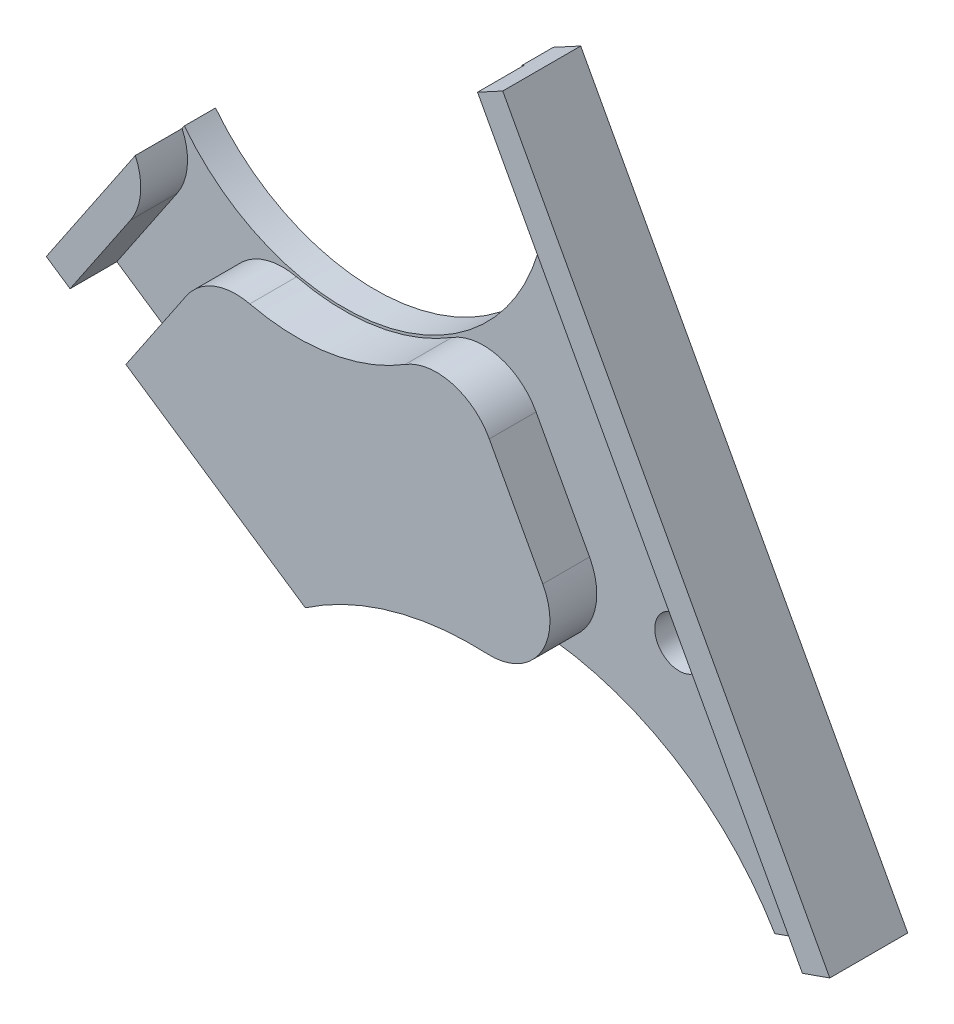
ISO-10303-21;
HEADER;
FILE_DESCRIPTION(('STEP AP214'),'2;1');
FILE_NAME('part.step','',(''),(''),'','','');
FILE_SCHEMA(('AUTOMOTIVE_DESIGN { 1 0 10303 214 1 1 1 1 }'));
ENDSEC;
DATA;
#1=APPLICATION_CONTEXT('core data for automotive mechanical design processes');
#2=APPLICATION_PROTOCOL_DEFINITION('international standard','automotive_design',2000,#1);
#3=PRODUCT_CONTEXT('',#1,'mechanical');
#4=PRODUCT('Part','Part','',(#3));
#5=PRODUCT_RELATED_PRODUCT_CATEGORY('part','',(#4));
#6=PRODUCT_DEFINITION_FORMATION('','',#4);
#7=PRODUCT_DEFINITION_CONTEXT('part definition',#1,'design');
#8=PRODUCT_DEFINITION('design','',#6,#7);
#9=PRODUCT_DEFINITION_SHAPE('','',#8);
#10=(LENGTH_UNIT() NAMED_UNIT(*) SI_UNIT(.MILLI.,.METRE.));
#11=(NAMED_UNIT(*) PLANE_ANGLE_UNIT() SI_UNIT($,.RADIAN.));
#12=(NAMED_UNIT(*) SI_UNIT($,.STERADIAN.) SOLID_ANGLE_UNIT());
#13=UNCERTAINTY_MEASURE_WITH_UNIT(LENGTH_MEASURE(1.E-05),#10,'distance_accuracy_value','');
#14=(GEOMETRIC_REPRESENTATION_CONTEXT(3) GLOBAL_UNCERTAINTY_ASSIGNED_CONTEXT((#13)) GLOBAL_UNIT_ASSIGNED_CONTEXT((#10,
#11,#12)) REPRESENTATION_CONTEXT('',''));
#15=CARTESIAN_POINT('',(0.,0.,0.));
#16=DIRECTION('',(0.,0.,1.));
#17=DIRECTION('',(1.,0.,0.));
#18=AXIS2_PLACEMENT_3D('',#15,#16,#17);
#19=CARTESIAN_POINT('',(0.,0.,1.5875));
#20=DIRECTION('',(0.,0.,1.));
#21=DIRECTION('',(1.,0.,0.));
#22=AXIS2_PLACEMENT_3D('',#19,#20,#21);
#23=PLANE('',#22);
#24=CARTESIAN_POINT('',(626.978202996506,410.564645837888,1.5875));
#25=DIRECTION('',(0.,0.,1.));
#26=DIRECTION('',(1.,0.,0.));
#27=AXIS2_PLACEMENT_3D('',#24,#25,#26);
#28=CIRCLE('',#27,2.48919999999995);
#29=CARTESIAN_POINT('',(629.467402996506,410.564645837888,1.5875));
#30=VERTEX_POINT('',#29);
#31=EDGE_CURVE('E388',#30,#30,#28,.T.);
#32=ORIENTED_EDGE('',*,*,#31,.F.);
#33=EDGE_LOOP('',(#32));
#34=FACE_BOUND('',#33,.T.);
#35=DIRECTION('',(0.475729779356439,-0.879591483038276,0.));
#36=VECTOR('',#35,1.);
#37=CARTESIAN_POINT('',(651.072310239757,352.134476593116,1.5875));
#38=LINE('',#37,#36);
#39=CARTESIAN_POINT('',(612.399980609735,423.636941328101,1.5875));
#40=VERTEX_POINT('',#39);
#41=CARTESIAN_POINT('',(617.846966450406,413.565840964854,1.5875));
#42=VERTEX_POINT('',#41);
#43=EDGE_CURVE('E128',#40,#42,#38,.T.);
#44=ORIENTED_EDGE('',*,*,#43,.T.);
#45=CARTESIAN_POINT('',(612.484976769804,410.665792229897,1.5875));
#46=DIRECTION('',(0.,0.,1.));
#47=DIRECTION('',(1.,0.,0.));
#48=AXIS2_PLACEMENT_3D('',#45,#46,#47);
#49=CIRCLE('',#48,6.096);
#50=CARTESIAN_POINT('',(612.182554443102,404.577298431238,1.5875));
#51=VERTEX_POINT('',#50);
#52=EDGE_CURVE('E12',#42,#51,#49,.F.);
#53=ORIENTED_EDGE('',*,*,#52,.T.);
#54=CARTESIAN_POINT('',(610.681654663716,374.360551212786,1.5875));
#55=DIRECTION('',(0.,0.,1.));
#56=DIRECTION('',(1.,0.,0.));
#57=AXIS2_PLACEMENT_3D('',#54,#55,#56);
#58=CIRCLE('',#57,30.2539999440004);
#59=CARTESIAN_POINT('',(636.711022177518,389.780555734283,1.5875));
#60=VERTEX_POINT('',#59);
#61=EDGE_CURVE('E259',#60,#51,#58,.T.);
#62=ORIENTED_EDGE('',*,*,#61,.F.);
#63=DIRECTION('',(-0.943278925331095,-0.332001308771841,0.));
#64=VECTOR('',#63,1.);
#65=CARTESIAN_POINT('',(-51.8861243691058,147.418357522562,1.5875));
#66=LINE('',#65,#64);
#67=CARTESIAN_POINT('',(644.285487293963,392.446503487779,1.5875));
#68=VERTEX_POINT('',#67);
#69=EDGE_CURVE('E385',#68,#60,#66,.T.);
#70=ORIENTED_EDGE('',*,*,#69,.F.);
#71=DIRECTION('',(0.475729779356438,-0.879591483038277,0.));
#72=VECTOR('',#71,1.);
#73=CARTESIAN_POINT('',(662.689954547727,358.417915518856,1.5875));
#74=LINE('',#73,#72);
#75=CARTESIAN_POINT('',(611.201099128583,453.617250652625,1.5875));
#76=VERTEX_POINT('',#75);
#77=EDGE_CURVE('E443',#76,#68,#74,.T.);
#78=ORIENTED_EDGE('',*,*,#77,.F.);
#79=DIRECTION('',(0.879591483038274,0.475729779356444,0.));
#80=VECTOR('',#79,1.);
#81=CARTESIAN_POINT('',(-51.4888554191417,95.1993351337647,1.5875));
#82=LINE('',#81,#80);
#83=CARTESIAN_POINT('',(610.977682891891,453.496415288669,1.5875));
#84=VERTEX_POINT('',#83);
#85=EDGE_CURVE('E369',#84,#76,#82,.T.);
#86=ORIENTED_EDGE('',*,*,#85,.F.);
#87=CARTESIAN_POINT('',(592.825113660689,443.6785419672,1.5875));
#88=DIRECTION('',(0.,0.,1.));
#89=DIRECTION('',(1.,0.,0.));
#90=AXIS2_PLACEMENT_3D('',#87,#88,#89);
#91=CIRCLE('',#90,20.6375);
#92=CARTESIAN_POINT('',(576.580250753386,430.950194259311,1.5875));
#93=VERTEX_POINT('',#92);
#94=EDGE_CURVE('E373',#93,#84,#91,.T.);
#95=ORIENTED_EDGE('',*,*,#94,.F.);
#96=DIRECTION('',(0.559192903470735,0.82903757255505,0.));
#97=VECTOR('',#96,1.);
#98=CARTESIAN_POINT('',(196.500476039685,-132.541244652355,1.5875));
#99=LINE('',#98,#97);
#100=CARTESIAN_POINT('',(576.350679015296,430.609840160944,1.5875));
#101=VERTEX_POINT('',#100);
#102=EDGE_CURVE('E378',#101,#93,#99,.T.);
#103=ORIENTED_EDGE('',*,*,#102,.F.);
#104=CARTESIAN_POINT('',(570.808499923693,428.071047747886,1.5875));
#105=DIRECTION('',(0.,0.,1.));
#106=DIRECTION('',(1.,0.,0.));
#107=AXIS2_PLACEMENT_3D('',#104,#105,#106);
#108=CIRCLE('',#107,6.09599999999994);
#109=CARTESIAN_POINT('',(575.862312965989,424.662207808329,1.5875));
#110=VERTEX_POINT('',#109);
#111=EDGE_CURVE('E450',#110,#101,#108,.T.);
#112=ORIENTED_EDGE('',*,*,#111,.F.);
#113=DIRECTION('',(0.559192903470747,0.829037572555042,0.));
#114=VECTOR('',#113,1.);
#115=CARTESIAN_POINT('',(198.922094789109,-134.17464712339,1.5875));
#116=LINE('',#115,#114);
#117=CARTESIAN_POINT('',(569.705397766146,415.5342056466,1.5875));
#118=VERTEX_POINT('',#117);
#119=EDGE_CURVE('E446',#118,#110,#116,.T.);
#120=ORIENTED_EDGE('',*,*,#119,.F.);
#121=DIRECTION('',(-0.829037572555042,0.559192903470746,0.));
#122=VECTOR('',#121,1.);
#123=CARTESIAN_POINT('',(370.783302977037,549.70885276999,1.5875));
#124=LINE('',#123,#122);
#125=CARTESIAN_POINT('',(575.390937438729,411.699260714597,1.5875));
#126=VERTEX_POINT('',#125);
#127=EDGE_CURVE('E140',#126,#118,#124,.T.);
#128=ORIENTED_EDGE('',*,*,#127,.F.);
#129=DIRECTION('',(0.559192903470747,0.829037572555042,0.));
#130=VECTOR('',#129,1.);
#131=CARTESIAN_POINT('',(204.607634461691,-138.009592055393,1.5875));
#132=LINE('',#131,#130);
#133=CARTESIAN_POINT('',(581.547852638571,420.827262876326,1.5875));
#134=VERTEX_POINT('',#133);
#135=EDGE_CURVE('E454',#126,#134,#132,.T.);
#136=ORIENTED_EDGE('',*,*,#135,.T.);
#137=CARTESIAN_POINT('',(586.601665680867,417.418422936768,1.5875));
#138=DIRECTION('',(0.,0.,1.));
#139=DIRECTION('',(1.,0.,0.));
#140=AXIS2_PLACEMENT_3D('',#137,#138,#139);
#141=CIRCLE('',#140,6.09600000000007);
#142=CARTESIAN_POINT('',(588.007432753956,423.350120411878,1.5875));
#143=VERTEX_POINT('',#142);
#144=EDGE_CURVE('E458',#143,#134,#141,.T.);
#145=ORIENTED_EDGE('',*,*,#144,.F.);
#146=CARTESIAN_POINT('',(592.825113660689,443.6785419672,1.5875));
#147=DIRECTION('',(0.,0.,1.));
#148=DIRECTION('',(1.,0.,0.));
#149=AXIS2_PLACEMENT_3D('',#146,#147,#148);
#150=CIRCLE('',#149,20.8915);
#151=CARTESIAN_POINT('',(603.827552769674,425.919006334108,1.5875));
#152=VERTEX_POINT('',#151);
#153=EDGE_CURVE('E461',#152,#143,#150,.F.);
#154=ORIENTED_EDGE('',*,*,#153,.F.);
#155=CARTESIAN_POINT('',(607.037990929134,420.736892593144,1.5875));
#156=DIRECTION('',(0.,0.,1.));
#157=DIRECTION('',(1.,0.,0.));
#158=AXIS2_PLACEMENT_3D('',#155,#156,#157);
#159=CIRCLE('',#158,6.09600000000001);
#160=EDGE_CURVE('E464',#40,#152,#159,.T.);
#161=ORIENTED_EDGE('',*,*,#160,.F.);
#162=EDGE_LOOP('',(#44,#53,#62,#70,#78,#86,#95,#103,#112,#120,#128,#136,#145,#154,#161));
#163=FACE_BOUND('',#162,.T.);
#164=ADVANCED_FACE('F119',(#34,#163),#23,.T.);
#165=CARTESIAN_POINT('',(665.259241269681,359.807522204356,1.5875));
#166=DIRECTION('',(0.879591483038276,0.475729779356438,0.));
#167=DIRECTION('',(-0.475729779356438,0.879591483038277,0.));
#168=AXIS2_PLACEMENT_3D('',#165,#166,#167);
#169=PLANE('',#168);
#170=DIRECTION('',(0.,0.,-1.));
#171=VECTOR('',#170,1.);
#172=CARTESIAN_POINT('',(647.075278433135,393.42841274551,1.5875));
#173=LINE('',#172,#171);
#174=CARTESIAN_POINT('',(647.075278433135,393.42841274551,6.35));
#175=VERTEX_POINT('',#174);
#176=CARTESIAN_POINT('',(647.075278433135,393.42841274551,-1.5875));
#177=VERTEX_POINT('',#176);
#178=EDGE_CURVE('E392',#175,#177,#173,.T.);
#179=ORIENTED_EDGE('',*,*,#178,.T.);
#180=DIRECTION('',(0.475729779356438,-0.879591483038277,0.));
#181=VECTOR('',#180,1.);
#182=CARTESIAN_POINT('',(665.259241269681,359.807522204356,-1.5875));
#183=LINE('',#182,#181);
#184=CARTESIAN_POINT('',(613.770385850538,455.006857338125,-1.5875));
#185=VERTEX_POINT('',#184);
#186=EDGE_CURVE('E368',#185,#177,#183,.T.);
#187=ORIENTED_EDGE('',*,*,#186,.F.);
#188=DIRECTION('',(0.,0.,-1.));
#189=VECTOR('',#188,1.);
#190=CARTESIAN_POINT('',(613.770385850538,455.006857338125,1.5875));
#191=LINE('',#190,#189);
#192=CARTESIAN_POINT('',(613.770385850538,455.006857338125,6.35));
#193=VERTEX_POINT('',#192);
#194=EDGE_CURVE('E440',#193,#185,#191,.T.);
#195=ORIENTED_EDGE('',*,*,#194,.F.);
#196=DIRECTION('',(0.475729779356438,-0.879591483038277,0.));
#197=VECTOR('',#196,1.);
#198=CARTESIAN_POINT('',(665.259241269681,359.807522204356,6.35));
#199=LINE('',#198,#197);
#200=EDGE_CURVE('E353',#193,#175,#199,.T.);
#201=ORIENTED_EDGE('',*,*,#200,.T.);
#202=EDGE_LOOP('',(#179,#187,#195,#201));
#203=FACE_BOUND('',#202,.T.);
#204=ADVANCED_FACE('F121',(#203),#169,.T.);
#205=CARTESIAN_POINT('',(-51.4888554191417,95.1993351337647,1.5875));
#206=DIRECTION('',(-0.475729779356444,0.879591483038273,0.));
#207=DIRECTION('',(-0.879591483038273,-0.475729779356444,0.));
#208=AXIS2_PLACEMENT_3D('',#205,#206,#207);
#209=PLANE('',#208);
#210=ORIENTED_EDGE('',*,*,#85,.T.);
#211=DIRECTION('',(0.,0.,-1.));
#212=VECTOR('',#211,1.);
#213=CARTESIAN_POINT('',(611.201099128583,453.617250652625,6.35));
#214=LINE('',#213,#212);
#215=CARTESIAN_POINT('',(611.201099128583,453.617250652625,6.35));
#216=VERTEX_POINT('',#215);
#217=EDGE_CURVE('E361',#216,#76,#214,.T.);
#218=ORIENTED_EDGE('',*,*,#217,.F.);
#219=DIRECTION('',(0.879591483038274,0.475729779356444,0.));
#220=VECTOR('',#219,1.);
#221=CARTESIAN_POINT('',(-51.4888554191417,95.1993351337647,6.35));
#222=LINE('',#221,#220);
#223=EDGE_CURVE('E357',#216,#193,#222,.T.);
#224=ORIENTED_EDGE('',*,*,#223,.T.);
#225=ORIENTED_EDGE('',*,*,#194,.T.);
#226=DIRECTION('',(0.879591483038274,0.475729779356444,0.));
#227=VECTOR('',#226,1.);
#228=CARTESIAN_POINT('',(-51.4888554191417,95.1993351337647,-1.5875));
#229=LINE('',#228,#227);
#230=CARTESIAN_POINT('',(610.977682891891,453.496415288669,-1.5875));
#231=VERTEX_POINT('',#230);
#232=EDGE_CURVE('E396',#231,#185,#229,.T.);
#233=ORIENTED_EDGE('',*,*,#232,.F.);
#234=DIRECTION('',(0.,0.,-1.));
#235=VECTOR('',#234,1.);
#236=CARTESIAN_POINT('',(610.977682891891,453.496415288669,1.5875));
#237=LINE('',#236,#235);
#238=EDGE_CURVE('E437',#84,#231,#237,.T.);
#239=ORIENTED_EDGE('',*,*,#238,.F.);
#240=EDGE_LOOP('',(#210,#218,#224,#225,#233,#239));
#241=FACE_BOUND('',#240,.T.);
#242=ADVANCED_FACE('F504',(#241),#209,.T.);
#243=CARTESIAN_POINT('',(592.825113660689,443.6785419672,1.5875));
#244=DIRECTION('',(0.,0.,-1.));
#245=DIRECTION('',(-1.,0.,0.));
#246=AXIS2_PLACEMENT_3D('',#243,#244,#245);
#247=CYLINDRICAL_SURFACE('',#246,20.6375);
#248=CARTESIAN_POINT('',(592.825113660689,443.6785419672,-1.5875));
#249=DIRECTION('',(0.,0.,1.));
#250=DIRECTION('',(1.,0.,0.));
#251=AXIS2_PLACEMENT_3D('',#248,#249,#250);
#252=CIRCLE('',#251,20.6375);
#253=CARTESIAN_POINT('',(576.580250753386,430.950194259311,-1.5875));
#254=VERTEX_POINT('',#253);
#255=EDGE_CURVE('E400',#254,#231,#252,.T.);
#256=ORIENTED_EDGE('',*,*,#255,.F.);
#257=DIRECTION('',(0.,0.,-1.));
#258=VECTOR('',#257,1.);
#259=CARTESIAN_POINT('',(576.580250753386,430.950194259311,1.5875));
#260=LINE('',#259,#258);
#261=EDGE_CURVE('E434',#93,#254,#260,.T.);
#262=ORIENTED_EDGE('',*,*,#261,.F.);
#263=ORIENTED_EDGE('',*,*,#94,.T.);
#264=ORIENTED_EDGE('',*,*,#238,.T.);
#265=EDGE_LOOP('',(#256,#262,#263,#264));
#266=FACE_BOUND('',#265,.T.);
#267=ADVANCED_FACE('F508',(#266),#247,.F.);
#268=CARTESIAN_POINT('',(196.500476039685,-132.541244652355,1.5875));
#269=DIRECTION('',(-0.82903757255505,0.559192903470735,0.));
#270=DIRECTION('',(-0.559192903470735,-0.82903757255505,0.));
#271=AXIS2_PLACEMENT_3D('',#268,#269,#270);
#272=PLANE('',#271);
#273=DIRECTION('',(0.,0.,-1.));
#274=VECTOR('',#273,1.);
#275=CARTESIAN_POINT('',(576.350679015296,430.609840160944,6.35));
#276=LINE('',#275,#274);
#277=CARTESIAN_POINT('',(576.350679015296,430.609840160944,6.35));
#278=VERTEX_POINT('',#277);
#279=EDGE_CURVE('E341',#278,#101,#276,.T.);
#280=ORIENTED_EDGE('',*,*,#279,.T.);
#281=ORIENTED_EDGE('',*,*,#102,.T.);
#282=ORIENTED_EDGE('',*,*,#261,.T.);
#283=DIRECTION('',(0.559192903470735,0.82903757255505,0.));
#284=VECTOR('',#283,1.);
#285=CARTESIAN_POINT('',(196.500476039685,-132.541244652355,-1.5875));
#286=LINE('',#285,#284);
#287=CARTESIAN_POINT('',(567.283779016713,417.167608117638,-1.5875));
#288=VERTEX_POINT('',#287);
#289=EDGE_CURVE('E404',#288,#254,#286,.T.);
#290=ORIENTED_EDGE('',*,*,#289,.F.);
#291=DIRECTION('',(0.,0.,-1.));
#292=VECTOR('',#291,1.);
#293=CARTESIAN_POINT('',(567.283779016713,417.167608117638,1.5875));
#294=LINE('',#293,#292);
#295=CARTESIAN_POINT('',(567.283779016713,417.167608117638,6.35));
#296=VERTEX_POINT('',#295);
#297=EDGE_CURVE('E431',#296,#288,#294,.T.);
#298=ORIENTED_EDGE('',*,*,#297,.F.);
#299=DIRECTION('',(0.559192903470735,0.82903757255505,0.));
#300=VECTOR('',#299,1.);
#301=CARTESIAN_POINT('',(196.500476039685,-132.541244652355,6.35));
#302=LINE('',#301,#300);
#303=EDGE_CURVE('E321',#296,#278,#302,.T.);
#304=ORIENTED_EDGE('',*,*,#303,.T.);
#305=EDGE_LOOP('',(#280,#281,#282,#290,#298,#304));
#306=FACE_BOUND('',#305,.T.);
#307=ADVANCED_FACE('F514',(#306),#272,.T.);
#308=CARTESIAN_POINT('',(370.783302977037,549.70885276999,1.5875));
#309=DIRECTION('',(-0.559192903470746,-0.829037572555042,0.));
#310=DIRECTION('',(0.829037572555042,-0.559192903470746,0.));
#311=AXIS2_PLACEMENT_3D('',#308,#309,#310);
#312=PLANE('',#311);
#313=DIRECTION('',(0.,0.,-1.));
#314=VECTOR('',#313,1.);
#315=CARTESIAN_POINT('',(575.390937438729,411.699260714598,6.35));
#316=LINE('',#315,#314);
#317=CARTESIAN_POINT('',(575.390937438729,411.699260714598,6.35));
#318=VERTEX_POINT('',#317);
#319=EDGE_CURVE('E135',#318,#126,#316,.T.);
#320=ORIENTED_EDGE('',*,*,#319,.T.);
#321=ORIENTED_EDGE('',*,*,#127,.T.);
#322=DIRECTION('',(0.,0.,-1.));
#323=VECTOR('',#322,1.);
#324=CARTESIAN_POINT('',(569.705397766147,415.5342056466,6.35));
#325=LINE('',#324,#323);
#326=CARTESIAN_POINT('',(569.705397766147,415.5342056466,6.35));
#327=VERTEX_POINT('',#326);
#328=EDGE_CURVE('E337',#327,#118,#325,.T.);
#329=ORIENTED_EDGE('',*,*,#328,.F.);
#330=DIRECTION('',(-0.829037572555042,0.559192903470746,0.));
#331=VECTOR('',#330,1.);
#332=CARTESIAN_POINT('',(370.783302977037,549.70885276999,6.35));
#333=LINE('',#332,#331);
#334=EDGE_CURVE('E325',#327,#296,#333,.T.);
#335=ORIENTED_EDGE('',*,*,#334,.T.);
#336=ORIENTED_EDGE('',*,*,#297,.T.);
#337=DIRECTION('',(-0.829037572555042,0.559192903470746,0.));
#338=VECTOR('',#337,1.);
#339=CARTESIAN_POINT('',(370.783302977037,549.70885276999,-1.5875));
#340=LINE('',#339,#338);
#341=CARTESIAN_POINT('',(593.663482074535,399.374273733363,-1.5875));
#342=VERTEX_POINT('',#341);
#343=EDGE_CURVE('E408',#342,#288,#340,.T.);
#344=ORIENTED_EDGE('',*,*,#343,.F.);
#345=DIRECTION('',(0.,0.,-1.));
#346=VECTOR('',#345,1.);
#347=CARTESIAN_POINT('',(593.663482074535,399.374273733363,1.5875));
#348=LINE('',#347,#346);
#349=CARTESIAN_POINT('',(593.663482074535,399.374273733363,6.35));
#350=VERTEX_POINT('',#349);
#351=EDGE_CURVE('E428',#350,#342,#348,.T.);
#352=ORIENTED_EDGE('',*,*,#351,.F.);
#353=DIRECTION('',(-0.829037572555042,0.559192903470746,0.));
#354=VECTOR('',#353,1.);
#355=CARTESIAN_POINT('',(370.783302977037,549.70885276999,6.35));
#356=LINE('',#355,#354);
#357=EDGE_CURVE('E275',#350,#318,#356,.T.);
#358=ORIENTED_EDGE('',*,*,#357,.T.);
#359=EDGE_LOOP('',(#320,#321,#329,#335,#336,#344,#352,#358));
#360=FACE_BOUND('',#359,.T.);
#361=ADVANCED_FACE('F487',(#360),#312,.T.);
#362=CARTESIAN_POINT('',(610.681654663716,374.360551212786,1.5875));
#363=DIRECTION('',(0.,0.,-1.));
#364=DIRECTION('',(-1.,0.,0.));
#365=AXIS2_PLACEMENT_3D('',#362,#363,#364);
#366=CYLINDRICAL_SURFACE('',#365,30.2539999440004);
#367=ORIENTED_EDGE('',*,*,#61,.T.);
#368=DIRECTION('',(0.,0.,-1.));
#369=VECTOR('',#368,1.);
#370=CARTESIAN_POINT('',(612.182554443102,404.577298431238,6.35));
#371=LINE('',#370,#369);
#372=CARTESIAN_POINT('',(612.182554443102,404.577298431238,6.35));
#373=VERTEX_POINT('',#372);
#374=EDGE_CURVE('E251',#373,#51,#371,.T.);
#375=ORIENTED_EDGE('',*,*,#374,.F.);
#376=CARTESIAN_POINT('',(610.681654663716,374.360551212786,6.35));
#377=DIRECTION('',(0.,0.,1.));
#378=DIRECTION('',(1.,0.,0.));
#379=AXIS2_PLACEMENT_3D('',#376,#377,#378);
#380=CIRCLE('',#379,30.2539999440004);
#381=EDGE_CURVE('E255',#373,#350,#380,.T.);
#382=ORIENTED_EDGE('',*,*,#381,.T.);
#383=ORIENTED_EDGE('',*,*,#351,.T.);
#384=CARTESIAN_POINT('',(610.681654663716,374.360551212786,-1.5875));
#385=DIRECTION('',(0.,0.,1.));
#386=DIRECTION('',(1.,0.,0.));
#387=AXIS2_PLACEMENT_3D('',#384,#385,#386);
#388=CIRCLE('',#387,30.2539999440004);
#389=CARTESIAN_POINT('',(636.711022177518,389.780555734283,-1.5875));
#390=VERTEX_POINT('',#389);
#391=EDGE_CURVE('E412',#390,#342,#388,.T.);
#392=ORIENTED_EDGE('',*,*,#391,.F.);
#393=DIRECTION('',(0.,0.,-1.));
#394=VECTOR('',#393,1.);
#395=CARTESIAN_POINT('',(636.711022177518,389.780555734283,1.5875));
#396=LINE('',#395,#394);
#397=EDGE_CURVE('E425',#60,#390,#396,.T.);
#398=ORIENTED_EDGE('',*,*,#397,.F.);
#399=EDGE_LOOP('',(#367,#375,#382,#383,#392,#398));
#400=FACE_BOUND('',#399,.T.);
#401=ADVANCED_FACE('F253',(#400),#366,.F.);
#402=CARTESIAN_POINT('',(-51.8861243691058,147.418357522562,1.5875));
#403=DIRECTION('',(0.332001308771841,-0.943278925331094,0.));
#404=DIRECTION('',(0.943278925331095,0.332001308771841,0.));
#405=AXIS2_PLACEMENT_3D('',#402,#403,#404);
#406=PLANE('',#405);
#407=DIRECTION('',(0.,0.,-1.));
#408=VECTOR('',#407,1.);
#409=CARTESIAN_POINT('',(644.285487293963,392.446503487779,6.35));
#410=LINE('',#409,#408);
#411=CARTESIAN_POINT('',(644.285487293963,392.446503487779,6.35));
#412=VERTEX_POINT('',#411);
#413=EDGE_CURVE('E364',#412,#68,#410,.T.);
#414=ORIENTED_EDGE('',*,*,#413,.T.);
#415=ORIENTED_EDGE('',*,*,#69,.T.);
#416=ORIENTED_EDGE('',*,*,#397,.T.);
#417=DIRECTION('',(-0.943278925331095,-0.332001308771841,0.));
#418=VECTOR('',#417,1.);
#419=CARTESIAN_POINT('',(-51.8861243691058,147.418357522562,-1.5875));
#420=LINE('',#419,#418);
#421=EDGE_CURVE('E416',#177,#390,#420,.T.);
#422=ORIENTED_EDGE('',*,*,#421,.F.);
#423=ORIENTED_EDGE('',*,*,#178,.F.);
#424=DIRECTION('',(-0.943278925331095,-0.332001308771841,0.));
#425=VECTOR('',#424,1.);
#426=CARTESIAN_POINT('',(-51.8861243691058,147.418357522562,6.35));
#427=LINE('',#426,#425);
#428=EDGE_CURVE('E349',#175,#412,#427,.T.);
#429=ORIENTED_EDGE('',*,*,#428,.T.);
#430=EDGE_LOOP('',(#414,#415,#416,#422,#423,#429));
#431=FACE_BOUND('',#430,.T.);
#432=ADVANCED_FACE('F496',(#431),#406,.T.);
#433=CARTESIAN_POINT('',(626.978202996506,410.564645837888,1.5875));
#434=DIRECTION('',(0.,0.,-1.));
#435=DIRECTION('',(-1.,0.,0.));
#436=AXIS2_PLACEMENT_3D('',#433,#434,#435);
#437=CYLINDRICAL_SURFACE('',#436,2.48919999999995);
#438=ORIENTED_EDGE('',*,*,#31,.T.);
#439=EDGE_LOOP('',(#438));
#440=FACE_BOUND('',#439,.T.);
#441=CARTESIAN_POINT('',(626.978202996506,410.564645837888,-1.5875));
#442=DIRECTION('',(0.,0.,1.));
#443=DIRECTION('',(1.,0.,0.));
#444=AXIS2_PLACEMENT_3D('',#441,#442,#443);
#445=CIRCLE('',#444,2.48919999999995);
#446=CARTESIAN_POINT('',(629.467402996506,410.564645837888,-1.5875));
#447=VERTEX_POINT('',#446);
#448=EDGE_CURVE('E374',#447,#447,#445,.T.);
#449=ORIENTED_EDGE('',*,*,#448,.F.);
#450=EDGE_LOOP('',(#449));
#451=FACE_BOUND('',#450,.T.);
#452=ADVANCED_FACE('F546',(#440,#451),#437,.F.);
#453=CARTESIAN_POINT('',(0.,0.,-1.5875));
#454=DIRECTION('',(0.,0.,1.));
#455=DIRECTION('',(1.,0.,0.));
#456=AXIS2_PLACEMENT_3D('',#453,#454,#455);
#457=PLANE('',#456);
#458=ORIENTED_EDGE('',*,*,#186,.T.);
#459=ORIENTED_EDGE('',*,*,#421,.T.);
#460=ORIENTED_EDGE('',*,*,#391,.T.);
#461=ORIENTED_EDGE('',*,*,#343,.T.);
#462=ORIENTED_EDGE('',*,*,#289,.T.);
#463=ORIENTED_EDGE('',*,*,#255,.T.);
#464=ORIENTED_EDGE('',*,*,#232,.T.);
#465=EDGE_LOOP('',(#458,#459,#460,#461,#462,#463,#464));
#466=FACE_BOUND('',#465,.T.);
#467=ORIENTED_EDGE('',*,*,#448,.T.);
#468=EDGE_LOOP('',(#467));
#469=FACE_BOUND('',#468,.T.);
#470=ADVANCED_FACE('F492',(#466,#469),#457,.F.);
#471=CARTESIAN_POINT('',(662.689954547727,358.417915518856,6.35));
#472=DIRECTION('',(-0.879591483038276,-0.475729779356438,0.));
#473=DIRECTION('',(0.475729779356438,-0.879591483038277,0.));
#474=AXIS2_PLACEMENT_3D('',#471,#472,#473);
#475=PLANE('',#474);
#476=ORIENTED_EDGE('',*,*,#217,.T.);
#477=ORIENTED_EDGE('',*,*,#77,.T.);
#478=ORIENTED_EDGE('',*,*,#413,.F.);
#479=DIRECTION('',(-0.475729779356438,0.879591483038277,0.));
#480=VECTOR('',#479,1.);
#481=CARTESIAN_POINT('',(662.689954547727,358.417915518856,6.35));
#482=LINE('',#481,#480);
#483=EDGE_CURVE('E345',#412,#216,#482,.T.);
#484=ORIENTED_EDGE('',*,*,#483,.T.);
#485=EDGE_LOOP('',(#476,#477,#478,#484));
#486=FACE_BOUND('',#485,.T.);
#487=ADVANCED_FACE('F543',(#486),#475,.T.);
#488=CARTESIAN_POINT('',(0.,0.,6.35));
#489=DIRECTION('',(0.,0.,1.));
#490=DIRECTION('',(1.,0.,0.));
#491=AXIS2_PLACEMENT_3D('',#488,#489,#490);
#492=PLANE('',#491);
#493=ORIENTED_EDGE('',*,*,#483,.F.);
#494=ORIENTED_EDGE('',*,*,#428,.F.);
#495=ORIENTED_EDGE('',*,*,#200,.F.);
#496=ORIENTED_EDGE('',*,*,#223,.F.);
#497=EDGE_LOOP('',(#493,#494,#495,#496));
#498=FACE_BOUND('',#497,.T.);
#499=ADVANCED_FACE('F530',(#498),#492,.T.);
#500=CARTESIAN_POINT('',(570.808499923693,428.071047747886,6.35));
#501=DIRECTION('',(0.,0.,-1.));
#502=DIRECTION('',(-1.,0.,0.));
#503=AXIS2_PLACEMENT_3D('',#500,#501,#502);
#504=CYLINDRICAL_SURFACE('',#503,6.09599999999994);
#505=DIRECTION('',(0.,0.,-1.));
#506=VECTOR('',#505,1.);
#507=CARTESIAN_POINT('',(575.862312965989,424.662207808329,6.35));
#508=LINE('',#507,#506);
#509=CARTESIAN_POINT('',(575.862312965989,424.662207808329,6.35));
#510=VERTEX_POINT('',#509);
#511=EDGE_CURVE('E333',#510,#110,#508,.T.);
#512=ORIENTED_EDGE('',*,*,#511,.T.);
#513=ORIENTED_EDGE('',*,*,#111,.T.);
#514=ORIENTED_EDGE('',*,*,#279,.F.);
#515=CARTESIAN_POINT('',(570.808499923693,428.071047747886,6.35));
#516=DIRECTION('',(0.,0.,1.));
#517=DIRECTION('',(1.,0.,0.));
#518=AXIS2_PLACEMENT_3D('',#515,#516,#517);
#519=CIRCLE('',#518,6.09599999999994);
#520=EDGE_CURVE('E262',#278,#510,#519,.F.);
#521=ORIENTED_EDGE('',*,*,#520,.T.);
#522=EDGE_LOOP('',(#512,#513,#514,#521));
#523=FACE_BOUND('',#522,.T.);
#524=ADVANCED_FACE('F512',(#523),#504,.T.);
#525=CARTESIAN_POINT('',(198.922094789109,-134.17464712339,6.35));
#526=DIRECTION('',(0.829037572555042,-0.559192903470747,0.));
#527=DIRECTION('',(0.559192903470747,0.829037572555042,0.));
#528=AXIS2_PLACEMENT_3D('',#525,#526,#527);
#529=PLANE('',#528);
#530=ORIENTED_EDGE('',*,*,#328,.T.);
#531=ORIENTED_EDGE('',*,*,#119,.T.);
#532=ORIENTED_EDGE('',*,*,#511,.F.);
#533=DIRECTION('',(-0.559192903470747,-0.829037572555042,0.));
#534=VECTOR('',#533,1.);
#535=CARTESIAN_POINT('',(198.922094789109,-134.17464712339,6.35));
#536=LINE('',#535,#534);
#537=EDGE_CURVE('E329',#510,#327,#536,.T.);
#538=ORIENTED_EDGE('',*,*,#537,.T.);
#539=EDGE_LOOP('',(#530,#531,#532,#538));
#540=FACE_BOUND('',#539,.T.);
#541=ADVANCED_FACE('F522',(#540),#529,.T.);
#542=CARTESIAN_POINT('',(0.,0.,6.35));
#543=DIRECTION('',(0.,0.,1.));
#544=DIRECTION('',(1.,0.,0.));
#545=AXIS2_PLACEMENT_3D('',#542,#543,#544);
#546=PLANE('',#545);
#547=ORIENTED_EDGE('',*,*,#520,.F.);
#548=ORIENTED_EDGE('',*,*,#303,.F.);
#549=ORIENTED_EDGE('',*,*,#334,.F.);
#550=ORIENTED_EDGE('',*,*,#537,.F.);
#551=EDGE_LOOP('',(#547,#548,#549,#550));
#552=FACE_BOUND('',#551,.T.);
#553=ADVANCED_FACE('F519',(#552),#546,.T.);
#554=CARTESIAN_POINT('',(612.484976769804,410.665792229897,6.35));
#555=DIRECTION('',(0.,0.,-1.));
#556=DIRECTION('',(-1.,0.,0.));
#557=AXIS2_PLACEMENT_3D('',#554,#555,#556);
#558=CYLINDRICAL_SURFACE('',#557,6.096);
#559=ORIENTED_EDGE('',*,*,#52,.F.);
#560=DIRECTION('',(0.,0.,-1.));
#561=VECTOR('',#560,1.);
#562=CARTESIAN_POINT('',(617.846966450406,413.565840964854,6.35));
#563=LINE('',#562,#561);
#564=CARTESIAN_POINT('',(617.846966450406,413.565840964854,6.35));
#565=VERTEX_POINT('',#564);
#566=EDGE_CURVE('E263',#565,#42,#563,.T.);
#567=ORIENTED_EDGE('',*,*,#566,.F.);
#568=CARTESIAN_POINT('',(612.484976769804,410.665792229897,6.35));
#569=DIRECTION('',(0.,0.,1.));
#570=DIRECTION('',(1.,0.,0.));
#571=AXIS2_PLACEMENT_3D('',#568,#569,#570);
#572=CIRCLE('',#571,6.096);
#573=EDGE_CURVE('E266',#373,#565,#572,.T.);
#574=ORIENTED_EDGE('',*,*,#573,.F.);
#575=ORIENTED_EDGE('',*,*,#374,.T.);
#576=EDGE_LOOP('',(#559,#567,#574,#575));
#577=FACE_BOUND('',#576,.T.);
#578=ADVANCED_FACE('F267',(#577),#558,.T.);
#579=CARTESIAN_POINT('',(651.072310239757,352.134476593116,6.35));
#580=DIRECTION('',(-0.879591483038276,-0.475729779356439,0.));
#581=DIRECTION('',(0.475729779356439,-0.879591483038276,0.));
#582=AXIS2_PLACEMENT_3D('',#579,#580,#581);
#583=PLANE('',#582);
#584=ORIENTED_EDGE('',*,*,#43,.F.);
#585=DIRECTION('',(0.,0.,-1.));
#586=VECTOR('',#585,1.);
#587=CARTESIAN_POINT('',(612.399980609735,423.636941328101,6.35));
#588=LINE('',#587,#586);
#589=CARTESIAN_POINT('',(612.399980609735,423.636941328101,6.35));
#590=VERTEX_POINT('',#589);
#591=EDGE_CURVE('E312',#590,#40,#588,.T.);
#592=ORIENTED_EDGE('',*,*,#591,.F.);
#593=DIRECTION('',(-0.475729779356439,0.879591483038276,0.));
#594=VECTOR('',#593,1.);
#595=CARTESIAN_POINT('',(651.072310239757,352.134476593116,6.35));
#596=LINE('',#595,#594);
#597=EDGE_CURVE('E272',#565,#590,#596,.T.);
#598=ORIENTED_EDGE('',*,*,#597,.F.);
#599=ORIENTED_EDGE('',*,*,#566,.T.);
#600=EDGE_LOOP('',(#584,#592,#598,#599));
#601=FACE_BOUND('',#600,.T.);
#602=ADVANCED_FACE('F473',(#601),#583,.F.);
#603=CARTESIAN_POINT('',(607.037990929134,420.736892593144,6.35));
#604=DIRECTION('',(0.,0.,-1.));
#605=DIRECTION('',(-1.,0.,0.));
#606=AXIS2_PLACEMENT_3D('',#603,#604,#605);
#607=CYLINDRICAL_SURFACE('',#606,6.09600000000001);
#608=ORIENTED_EDGE('',*,*,#591,.T.);
#609=ORIENTED_EDGE('',*,*,#160,.T.);
#610=DIRECTION('',(0.,0.,-1.));
#611=VECTOR('',#610,1.);
#612=CARTESIAN_POINT('',(603.827552769674,425.919006334108,6.35));
#613=LINE('',#612,#611);
#614=CARTESIAN_POINT('',(603.827552769674,425.919006334108,6.35));
#615=VERTEX_POINT('',#614);
#616=EDGE_CURVE('E308',#615,#152,#613,.T.);
#617=ORIENTED_EDGE('',*,*,#616,.F.);
#618=CARTESIAN_POINT('',(607.037990929134,420.736892593144,6.35));
#619=DIRECTION('',(0.,0.,1.));
#620=DIRECTION('',(1.,0.,0.));
#621=AXIS2_PLACEMENT_3D('',#618,#619,#620);
#622=CIRCLE('',#621,6.09600000000001);
#623=EDGE_CURVE('E281',#615,#590,#622,.F.);
#624=ORIENTED_EDGE('',*,*,#623,.T.);
#625=EDGE_LOOP('',(#608,#609,#617,#624));
#626=FACE_BOUND('',#625,.T.);
#627=ADVANCED_FACE('F475',(#626),#607,.T.);
#628=CARTESIAN_POINT('',(592.825113660689,443.6785419672,6.35));
#629=DIRECTION('',(0.,0.,-1.));
#630=DIRECTION('',(-1.,0.,0.));
#631=AXIS2_PLACEMENT_3D('',#628,#629,#630);
#632=CYLINDRICAL_SURFACE('',#631,20.8915);
#633=ORIENTED_EDGE('',*,*,#616,.T.);
#634=ORIENTED_EDGE('',*,*,#153,.T.);
#635=DIRECTION('',(0.,0.,-1.));
#636=VECTOR('',#635,1.);
#637=CARTESIAN_POINT('',(588.007432753956,423.350120411878,6.35));
#638=LINE('',#637,#636);
#639=CARTESIAN_POINT('',(588.007432753956,423.350120411878,6.35));
#640=VERTEX_POINT('',#639);
#641=EDGE_CURVE('E304',#640,#143,#638,.T.);
#642=ORIENTED_EDGE('',*,*,#641,.F.);
#643=CARTESIAN_POINT('',(592.825113660689,443.6785419672,6.35));
#644=DIRECTION('',(0.,0.,1.));
#645=DIRECTION('',(1.,0.,0.));
#646=AXIS2_PLACEMENT_3D('',#643,#644,#645);
#647=CIRCLE('',#646,20.8915);
#648=EDGE_CURVE('E285',#640,#615,#647,.T.);
#649=ORIENTED_EDGE('',*,*,#648,.T.);
#650=EDGE_LOOP('',(#633,#634,#642,#649));
#651=FACE_BOUND('',#650,.T.);
#652=ADVANCED_FACE('F480',(#651),#632,.F.);
#653=CARTESIAN_POINT('',(586.601665680867,417.418422936768,6.35));
#654=DIRECTION('',(0.,0.,-1.));
#655=DIRECTION('',(-1.,0.,0.));
#656=AXIS2_PLACEMENT_3D('',#653,#654,#655);
#657=CYLINDRICAL_SURFACE('',#656,6.09600000000007);
#658=ORIENTED_EDGE('',*,*,#641,.T.);
#659=ORIENTED_EDGE('',*,*,#144,.T.);
#660=DIRECTION('',(0.,0.,-1.));
#661=VECTOR('',#660,1.);
#662=CARTESIAN_POINT('',(581.547852638571,420.827262876326,6.35));
#663=LINE('',#662,#661);
#664=CARTESIAN_POINT('',(581.547852638571,420.827262876326,6.35));
#665=VERTEX_POINT('',#664);
#666=EDGE_CURVE('E300',#665,#134,#663,.T.);
#667=ORIENTED_EDGE('',*,*,#666,.F.);
#668=CARTESIAN_POINT('',(586.601665680867,417.418422936768,6.35));
#669=DIRECTION('',(0.,0.,1.));
#670=DIRECTION('',(1.,0.,0.));
#671=AXIS2_PLACEMENT_3D('',#668,#669,#670);
#672=CIRCLE('',#671,6.09600000000007);
#673=EDGE_CURVE('E289',#665,#640,#672,.F.);
#674=ORIENTED_EDGE('',*,*,#673,.T.);
#675=EDGE_LOOP('',(#658,#659,#667,#674));
#676=FACE_BOUND('',#675,.T.);
#677=ADVANCED_FACE('F483',(#676),#657,.T.);
#678=CARTESIAN_POINT('',(204.607634461691,-138.009592055393,6.35));
#679=DIRECTION('',(0.829037572555042,-0.559192903470747,0.));
#680=DIRECTION('',(0.559192903470747,0.829037572555042,0.));
#681=AXIS2_PLACEMENT_3D('',#678,#679,#680);
#682=PLANE('',#681);
#683=ORIENTED_EDGE('',*,*,#135,.F.);
#684=ORIENTED_EDGE('',*,*,#319,.F.);
#685=DIRECTION('',(-0.559192903470747,-0.829037572555042,0.));
#686=VECTOR('',#685,1.);
#687=CARTESIAN_POINT('',(204.607634461691,-138.009592055393,6.35));
#688=LINE('',#687,#686);
#689=EDGE_CURVE('E293',#665,#318,#688,.T.);
#690=ORIENTED_EDGE('',*,*,#689,.F.);
#691=ORIENTED_EDGE('',*,*,#666,.T.);
#692=EDGE_LOOP('',(#683,#684,#690,#691));
#693=FACE_BOUND('',#692,.T.);
#694=ADVANCED_FACE('F485',(#693),#682,.F.);
#695=CARTESIAN_POINT('',(0.,0.,6.35));
#696=DIRECTION('',(0.,0.,1.));
#697=DIRECTION('',(1.,0.,0.));
#698=AXIS2_PLACEMENT_3D('',#695,#696,#697);
#699=PLANE('',#698);
#700=ORIENTED_EDGE('',*,*,#381,.F.);
#701=ORIENTED_EDGE('',*,*,#573,.T.);
#702=ORIENTED_EDGE('',*,*,#597,.T.);
#703=ORIENTED_EDGE('',*,*,#623,.F.);
#704=ORIENTED_EDGE('',*,*,#648,.F.);
#705=ORIENTED_EDGE('',*,*,#673,.F.);
#706=ORIENTED_EDGE('',*,*,#689,.T.);
#707=ORIENTED_EDGE('',*,*,#357,.F.);
#708=EDGE_LOOP('',(#700,#701,#702,#703,#704,#705,#706,#707));
#709=FACE_BOUND('',#708,.T.);
#710=ADVANCED_FACE('F274',(#709),#699,.T.);
#711=CLOSED_SHELL('',(#164,#204,#242,#267,#307,#361,#401,#432,#452,#470,#487,#499,#524,#541,
#553,#578,#602,#627,#652,#677,#694,#710));
#712=MANIFOLD_SOLID_BREP('B2',#711);
#713=ADVANCED_BREP_SHAPE_REPRESENTATION('',(#18,#712),#14);
#714=SHAPE_DEFINITION_REPRESENTATION(#9,#713);
ENDSEC;
END-ISO-10303-21;
